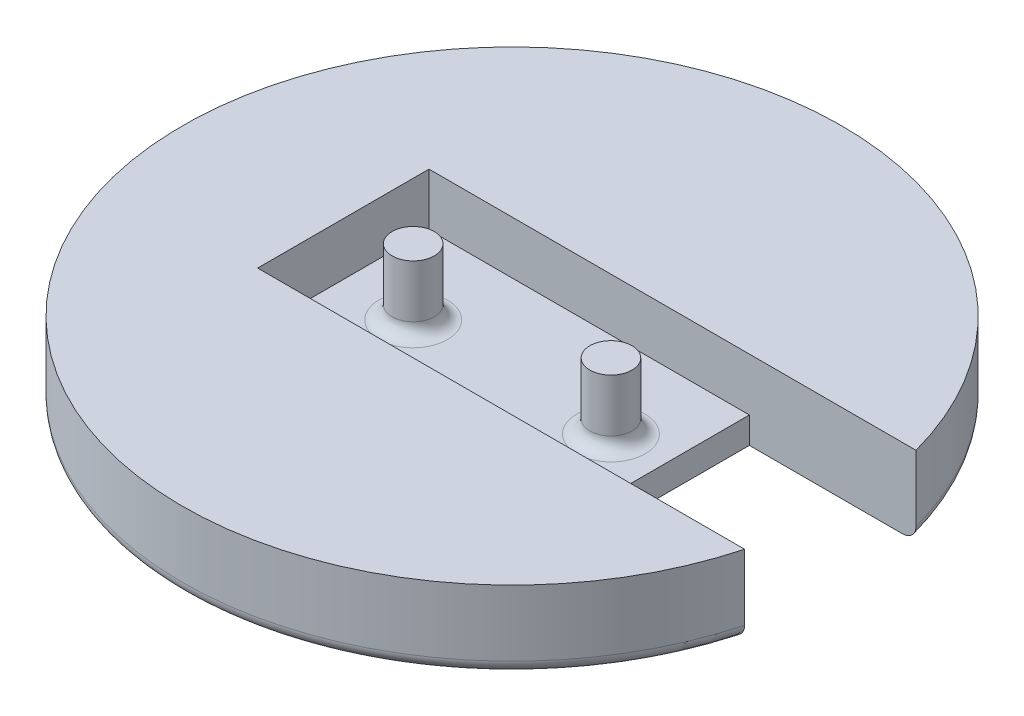
ISO-10303-21;
HEADER;
FILE_DESCRIPTION(('STEP AP214'),'2;1');
FILE_NAME('part.step','',(''),(''),'','','');
FILE_SCHEMA(('AUTOMOTIVE_DESIGN { 1 0 10303 214 1 1 1 1 }'));
ENDSEC;
DATA;
#1=APPLICATION_CONTEXT('core data for automotive mechanical design processes');
#2=APPLICATION_PROTOCOL_DEFINITION('international standard','automotive_design',2000,#1);
#3=PRODUCT_CONTEXT('',#1,'mechanical');
#4=PRODUCT('Part','Part','',(#3));
#5=PRODUCT_RELATED_PRODUCT_CATEGORY('part','',(#4));
#6=PRODUCT_DEFINITION_FORMATION('','',#4);
#7=PRODUCT_DEFINITION_CONTEXT('part definition',#1,'design');
#8=PRODUCT_DEFINITION('design','',#6,#7);
#9=PRODUCT_DEFINITION_SHAPE('','',#8);
#10=(LENGTH_UNIT() NAMED_UNIT(*) SI_UNIT(.MILLI.,.METRE.));
#11=(NAMED_UNIT(*) PLANE_ANGLE_UNIT() SI_UNIT($,.RADIAN.));
#12=(NAMED_UNIT(*) SI_UNIT($,.STERADIAN.) SOLID_ANGLE_UNIT());
#13=UNCERTAINTY_MEASURE_WITH_UNIT(LENGTH_MEASURE(1.E-05),#10,'distance_accuracy_value','');
#14=(GEOMETRIC_REPRESENTATION_CONTEXT(3) GLOBAL_UNCERTAINTY_ASSIGNED_CONTEXT((#13)) GLOBAL_UNIT_ASSIGNED_CONTEXT((#10,
#11,#12)) REPRESENTATION_CONTEXT('',''));
#15=CARTESIAN_POINT('',(0.,0.,0.));
#16=DIRECTION('',(0.,0.,1.));
#17=DIRECTION('',(1.,0.,0.));
#18=AXIS2_PLACEMENT_3D('',#15,#16,#17);
#19=CARTESIAN_POINT('',(0.,2.,0.));
#20=DIRECTION('',(0.,1.,0.));
#21=DIRECTION('',(0.,0.,1.));
#22=AXIS2_PLACEMENT_3D('',#19,#20,#21);
#23=PLANE('',#22);
#24=CARTESIAN_POINT('',(7.5,2.,0.));
#25=DIRECTION('',(0.,1.,0.));
#26=DIRECTION('',(0.,0.,1.));
#27=AXIS2_PLACEMENT_3D('',#24,#25,#26);
#28=CIRCLE('',#27,2.6);
#29=CARTESIAN_POINT('',(7.5,2.,2.6));
#30=VERTEX_POINT('',#29);
#31=EDGE_CURVE('E152',#30,#30,#28,.F.);
#32=ORIENTED_EDGE('',*,*,#31,.T.);
#33=EDGE_LOOP('',(#32));
#34=FACE_BOUND('',#33,.T.);
#35=CARTESIAN_POINT('',(-7.5,2.,0.));
#36=DIRECTION('',(0.,1.,0.));
#37=DIRECTION('',(0.,0.,1.));
#38=AXIS2_PLACEMENT_3D('',#35,#36,#37);
#39=CIRCLE('',#38,2.6);
#40=CARTESIAN_POINT('',(-7.5,2.,2.6));
#41=VERTEX_POINT('',#40);
#42=EDGE_CURVE('E149',#41,#41,#39,.F.);
#43=ORIENTED_EDGE('',*,*,#42,.T.);
#44=EDGE_LOOP('',(#43));
#45=FACE_BOUND('',#44,.T.);
#46=DIRECTION('',(0.,0.,1.));
#47=VECTOR('',#46,1.);
#48=CARTESIAN_POINT('',(11.5,2.,-6.5));
#49=LINE('',#48,#47);
#50=CARTESIAN_POINT('',(11.5,2.,-6.5));
#51=VERTEX_POINT('',#50);
#52=CARTESIAN_POINT('',(11.5,2.,6.5));
#53=VERTEX_POINT('',#52);
#54=EDGE_CURVE('E108',#51,#53,#49,.T.);
#55=ORIENTED_EDGE('',*,*,#54,.F.);
#56=DIRECTION('',(1.,0.,0.));
#57=VECTOR('',#56,1.);
#58=CARTESIAN_POINT('',(0.,2.,-6.5));
#59=LINE('',#58,#57);
#60=CARTESIAN_POINT('',(-12.8,2.,-6.5));
#61=VERTEX_POINT('',#60);
#62=EDGE_CURVE('E119',#61,#51,#59,.T.);
#63=ORIENTED_EDGE('',*,*,#62,.F.);
#64=DIRECTION('',(0.,0.,1.));
#65=VECTOR('',#64,1.);
#66=CARTESIAN_POINT('',(-12.8,2.,0.));
#67=LINE('',#66,#65);
#68=CARTESIAN_POINT('',(-12.8,2.,6.5));
#69=VERTEX_POINT('',#68);
#70=EDGE_CURVE('E129',#61,#69,#67,.T.);
#71=ORIENTED_EDGE('',*,*,#70,.T.);
#72=DIRECTION('',(1.,0.,0.));
#73=VECTOR('',#72,1.);
#74=CARTESIAN_POINT('',(0.,2.,6.5));
#75=LINE('',#74,#73);
#76=EDGE_CURVE('E122',#69,#53,#75,.T.);
#77=ORIENTED_EDGE('',*,*,#76,.T.);
#78=EDGE_LOOP('',(#55,#63,#71,#77));
#79=FACE_BOUND('',#78,.T.);
#80=ADVANCED_FACE('F41',(#34,#45,#79),#23,.T.);
#81=CARTESIAN_POINT('',(0.,2.,0.));
#82=DIRECTION('',(0.,-1.,0.));
#83=DIRECTION('',(0.,0.,-1.));
#84=AXIS2_PLACEMENT_3D('',#81,#82,#83);
#85=CYLINDRICAL_SURFACE('',#84,25.);
#86=DIRECTION('',(0.,-1.,0.));
#87=VECTOR('',#86,1.);
#88=CARTESIAN_POINT('',(24.1402154091466,6.,-6.5));
#89=LINE('',#88,#87);
#90=CARTESIAN_POINT('',(24.1402154091466,6.,-6.5));
#91=VERTEX_POINT('',#90);
#92=CARTESIAN_POINT('',(24.1402154091466,1.,-6.5));
#93=VERTEX_POINT('',#92);
#94=EDGE_CURVE('E142',#91,#93,#89,.T.);
#95=ORIENTED_EDGE('',*,*,#94,.T.);
#96=CARTESIAN_POINT('',(0.,1.,0.));
#97=DIRECTION('',(0.,1.,0.));
#98=DIRECTION('',(0.,0.,1.));
#99=AXIS2_PLACEMENT_3D('',#96,#97,#98);
#100=CIRCLE('',#99,25.);
#101=CARTESIAN_POINT('',(24.1402154091466,1.,6.5));
#102=VERTEX_POINT('',#101);
#103=EDGE_CURVE('E158',#93,#102,#100,.T.);
#104=ORIENTED_EDGE('',*,*,#103,.T.);
#105=DIRECTION('',(0.,-1.,0.));
#106=VECTOR('',#105,1.);
#107=CARTESIAN_POINT('',(24.1402154091466,6.,6.5));
#108=LINE('',#107,#106);
#109=CARTESIAN_POINT('',(24.1402154091466,6.,6.5));
#110=VERTEX_POINT('',#109);
#111=EDGE_CURVE('E139',#110,#102,#108,.T.);
#112=ORIENTED_EDGE('',*,*,#111,.F.);
#113=CARTESIAN_POINT('',(0.,6.,0.));
#114=DIRECTION('',(0.,1.,0.));
#115=DIRECTION('',(0.,0.,1.));
#116=AXIS2_PLACEMENT_3D('',#113,#114,#115);
#117=CIRCLE('',#116,25.);
#118=EDGE_CURVE('E226',#91,#110,#117,.T.);
#119=ORIENTED_EDGE('',*,*,#118,.F.);
#120=EDGE_LOOP('',(#95,#104,#112,#119));
#121=FACE_BOUND('',#120,.T.);
#122=ADVANCED_FACE('F182',(#121),#85,.T.);
#123=CARTESIAN_POINT('',(0.,0.,0.));
#124=DIRECTION('',(0.,1.,0.));
#125=DIRECTION('',(0.,0.,1.));
#126=AXIS2_PLACEMENT_3D('',#123,#124,#125);
#127=PLANE('',#126);
#128=DIRECTION('',(-1.,0.,0.));
#129=VECTOR('',#128,1.);
#130=CARTESIAN_POINT('',(11.5,0.,6.5));
#131=LINE('',#130,#129);
#132=CARTESIAN_POINT('',(23.1030301042958,0.,6.5));
#133=VERTEX_POINT('',#132);
#134=CARTESIAN_POINT('',(11.5,0.,6.5));
#135=VERTEX_POINT('',#134);
#136=EDGE_CURVE('E114',#133,#135,#131,.T.);
#137=ORIENTED_EDGE('',*,*,#136,.F.);
#138=CARTESIAN_POINT('',(0.,0.,0.));
#139=DIRECTION('',(0.,1.,0.));
#140=DIRECTION('',(0.,0.,1.));
#141=AXIS2_PLACEMENT_3D('',#138,#139,#140);
#142=CIRCLE('',#141,24.);
#143=CARTESIAN_POINT('',(23.1030301042958,0.,-6.5));
#144=VERTEX_POINT('',#143);
#145=EDGE_CURVE('E55',#133,#144,#142,.F.);
#146=ORIENTED_EDGE('',*,*,#145,.T.);
#147=DIRECTION('',(1.,0.,0.));
#148=VECTOR('',#147,1.);
#149=CARTESIAN_POINT('',(11.5,0.,-6.5));
#150=LINE('',#149,#148);
#151=CARTESIAN_POINT('',(11.5,0.,-6.5));
#152=VERTEX_POINT('',#151);
#153=EDGE_CURVE('E123',#152,#144,#150,.T.);
#154=ORIENTED_EDGE('',*,*,#153,.F.);
#155=DIRECTION('',(0.,0.,-1.));
#156=VECTOR('',#155,1.);
#157=CARTESIAN_POINT('',(11.5,0.,-6.5));
#158=LINE('',#157,#156);
#159=EDGE_CURVE('E111',#135,#152,#158,.T.);
#160=ORIENTED_EDGE('',*,*,#159,.F.);
#161=EDGE_LOOP('',(#137,#146,#154,#160));
#162=FACE_BOUND('',#161,.T.);
#163=ADVANCED_FACE('F178',(#162),#127,.F.);
#164=CARTESIAN_POINT('',(-12.8,6.,0.));
#165=DIRECTION('',(1.,0.,0.));
#166=DIRECTION('',(0.,0.,-1.));
#167=AXIS2_PLACEMENT_3D('',#164,#165,#166);
#168=PLANE('',#167);
#169=ORIENTED_EDGE('',*,*,#70,.F.);
#170=DIRECTION('',(0.,-1.,0.));
#171=VECTOR('',#170,1.);
#172=CARTESIAN_POINT('',(-12.8,6.,-6.5));
#173=LINE('',#172,#171);
#174=CARTESIAN_POINT('',(-12.8,6.,-6.5));
#175=VERTEX_POINT('',#174);
#176=EDGE_CURVE('E127',#175,#61,#173,.T.);
#177=ORIENTED_EDGE('',*,*,#176,.F.);
#178=DIRECTION('',(0.,0.,1.));
#179=VECTOR('',#178,1.);
#180=CARTESIAN_POINT('',(-12.8,6.,0.));
#181=LINE('',#180,#179);
#182=CARTESIAN_POINT('',(-12.8,6.,6.5));
#183=VERTEX_POINT('',#182);
#184=EDGE_CURVE('E131',#175,#183,#181,.T.);
#185=ORIENTED_EDGE('',*,*,#184,.T.);
#186=DIRECTION('',(0.,-1.,0.));
#187=VECTOR('',#186,1.);
#188=CARTESIAN_POINT('',(-12.8,6.,6.5));
#189=LINE('',#188,#187);
#190=EDGE_CURVE('E136',#183,#69,#189,.T.);
#191=ORIENTED_EDGE('',*,*,#190,.T.);
#192=EDGE_LOOP('',(#169,#177,#185,#191));
#193=FACE_BOUND('',#192,.T.);
#194=ADVANCED_FACE('F175',(#193),#168,.T.);
#195=CARTESIAN_POINT('',(0.,6.,-6.5));
#196=DIRECTION('',(0.,0.,-1.));
#197=DIRECTION('',(-1.,0.,0.));
#198=AXIS2_PLACEMENT_3D('',#195,#196,#197);
#199=PLANE('',#198);
#200=ORIENTED_EDGE('',*,*,#153,.T.);
#201=CARTESIAN_POINT('',(23.1030301042958,0.,-6.5));
#202=CARTESIAN_POINT('',(23.1630415020547,-4.07379461928211E-05,-6.5));
#203=CARTESIAN_POINT('',(23.2230543826841,0.00500385648985758,-6.5));
#204=CARTESIAN_POINT('',(23.3414319515449,0.0249995079032535,-6.5));
#205=CARTESIAN_POINT('',(23.3997959386903,0.0399547145540374,-6.5));
#206=CARTESIAN_POINT('',(23.5132240749441,0.0795253273005286,-6.5));
#207=CARTESIAN_POINT('',(23.5682851113786,0.104149685640048,-6.5));
#208=CARTESIAN_POINT('',(23.6733533652802,0.16246071700777,-6.5));
#209=CARTESIAN_POINT('',(23.7233632463739,0.196142579056975,-6.5));
#210=CARTESIAN_POINT('',(23.8158280924784,0.270975122606774,-6.5));
#211=CARTESIAN_POINT('',(23.858412152406,0.311966113934102,-6.5));
#212=CARTESIAN_POINT('',(23.935798240648,0.400760911553818,-6.5));
#213=CARTESIAN_POINT('',(23.9705994258328,0.448565455050072,-6.5));
#214=CARTESIAN_POINT('',(24.0301134062153,0.547811406869436,-6.5));
#215=CARTESIAN_POINT('',(24.0551367286314,0.599066905016923,-6.5));
#216=CARTESIAN_POINT('',(24.095891266569,0.705121150930986,-6.5));
#217=CARTESIAN_POINT('',(24.1116327864106,0.759915894258354,-6.5));
#218=CARTESIAN_POINT('',(24.1283635456409,0.845997783009671,-6.5));
#219=CARTESIAN_POINT('',(24.1328059369336,0.876651935967984,-6.5));
#220=CARTESIAN_POINT('',(24.138730442653,0.93819889948069,-6.5));
#221=CARTESIAN_POINT('',(24.1402169475169,0.969091287556799,-6.5));
#222=CARTESIAN_POINT('',(24.1402154091466,1.,-6.5));
#223=B_SPLINE_CURVE_WITH_KNOTS('',3,(#201,#202,#203,#204,#205,#206,#207,#208,#209,#210,#211,
#212,#213,#214,#215,#216,#217,#218,#219,#220,#221,#222),.UNSPECIFIED.,.F.,.F.,(4,2,2,2,2,2,2,2,
2,2,4),(0.,0.179827323787152,0.359729990705923,0.539799615851904,0.719773783585482,
0.89621304437835,1.07267140982926,1.24295223308869,1.4130436590981,1.50583996825724,
1.59849834194079),.UNSPECIFIED.);
#224=EDGE_CURVE('E11',#144,#93,#223,.T.);
#225=ORIENTED_EDGE('',*,*,#224,.T.);
#226=ORIENTED_EDGE('',*,*,#94,.F.);
#227=DIRECTION('',(1.,0.,0.));
#228=VECTOR('',#227,1.);
#229=CARTESIAN_POINT('',(0.,6.,-6.5));
#230=LINE('',#229,#228);
#231=EDGE_CURVE('E224',#175,#91,#230,.T.);
#232=ORIENTED_EDGE('',*,*,#231,.F.);
#233=ORIENTED_EDGE('',*,*,#176,.T.);
#234=ORIENTED_EDGE('',*,*,#62,.T.);
#235=DIRECTION('',(0.,1.,0.));
#236=VECTOR('',#235,1.);
#237=CARTESIAN_POINT('',(11.5,-0.00100000000000013,-6.5));
#238=LINE('',#237,#236);
#239=EDGE_CURVE('E104',#152,#51,#238,.T.);
#240=ORIENTED_EDGE('',*,*,#239,.F.);
#241=EDGE_LOOP('',(#200,#225,#226,#232,#233,#234,#240));
#242=FACE_BOUND('',#241,.T.);
#243=ADVANCED_FACE('F125',(#242),#199,.F.);
#244=CARTESIAN_POINT('',(0.,6.,6.5));
#245=DIRECTION('',(0.,0.,-1.));
#246=DIRECTION('',(-1.,0.,0.));
#247=AXIS2_PLACEMENT_3D('',#244,#245,#246);
#248=PLANE('',#247);
#249=ORIENTED_EDGE('',*,*,#111,.T.);
#250=CARTESIAN_POINT('',(24.1402154091466,1.,6.5));
#251=CARTESIAN_POINT('',(24.140215711531,0.972574378559675,6.5));
#252=CARTESIAN_POINT('',(24.1390462036471,0.945162140716668,6.5));
#253=CARTESIAN_POINT('',(24.1343838720928,0.890539107579561,6.5));
#254=CARTESIAN_POINT('',(24.1308913149175,0.863328289541028,6.5));
#255=CARTESIAN_POINT('',(24.1169770014243,0.782389398431225,6.5));
#256=CARTESIAN_POINT('',(24.1031184079865,0.729212150299668,6.5));
#257=CARTESIAN_POINT('',(24.0666957413309,0.625955034785746,6.5));
#258=CARTESIAN_POINT('',(24.0441303145989,0.575875650384598,6.5));
#259=CARTESIAN_POINT('',(23.9910268867018,0.480134523518647,6.5));
#260=CARTESIAN_POINT('',(23.9604881895474,0.434473167182023,6.5));
#261=CARTESIAN_POINT('',(23.8918959254077,0.348124440741823,6.5));
#262=CARTESIAN_POINT('',(23.8537407094715,0.307517943943999,6.5));
#263=CARTESIAN_POINT('',(23.7713427820477,0.233035342366017,6.5));
#264=CARTESIAN_POINT('',(23.7270986668402,0.199160793966627,6.5));
#265=CARTESIAN_POINT('',(23.6322447123132,0.137921388155156,6.5));
#266=CARTESIAN_POINT('',(23.5814736933651,0.110806450520316,6.5));
#267=CARTESIAN_POINT('',(23.4762057711506,0.0651735318225097,6.5));
#268=CARTESIAN_POINT('',(23.4217090938878,0.0466550298178436,6.5));
#269=CARTESIAN_POINT('',(23.3231169461925,0.0217776315225423,6.5));
#270=CARTESIAN_POINT('',(23.2794665813232,0.0136132632662862,6.5));
#271=CARTESIAN_POINT('',(23.1915575420011,0.00272432994374768,6.5));
#272=CARTESIAN_POINT('',(23.1472998572429,-8.22248499426573E-06,6.5));
#273=CARTESIAN_POINT('',(23.1030301042958,0.,6.5));
#274=B_SPLINE_CURVE_WITH_KNOTS('',3,(#250,#251,#252,#253,#254,#255,#256,#257,#258,#259,#260,
#261,#262,#263,#264,#265,#266,#267,#268,#269,#270,#271,#272,#273),.UNSPECIFIED.,.F.,.F.,(4,2,2,
2,2,2,2,2,2,2,2,4),(0.,0.0822254878023891,0.164441544505478,0.328450982718256,0.492485927172884,
0.656535195078799,0.822941020941132,0.989385274058812,1.16128810414714,1.3331805156096,
1.46607709299259,1.59877810397102),.UNSPECIFIED.);
#275=EDGE_CURVE('E69',#102,#133,#274,.T.);
#276=ORIENTED_EDGE('',*,*,#275,.T.);
#277=ORIENTED_EDGE('',*,*,#136,.T.);
#278=DIRECTION('',(0.,1.,0.));
#279=VECTOR('',#278,1.);
#280=CARTESIAN_POINT('',(11.5,-0.00100000000000013,6.5));
#281=LINE('',#280,#279);
#282=EDGE_CURVE('E115',#135,#53,#281,.T.);
#283=ORIENTED_EDGE('',*,*,#282,.T.);
#284=ORIENTED_EDGE('',*,*,#76,.F.);
#285=ORIENTED_EDGE('',*,*,#190,.F.);
#286=DIRECTION('',(1.,0.,0.));
#287=VECTOR('',#286,1.);
#288=CARTESIAN_POINT('',(0.,6.,6.5));
#289=LINE('',#288,#287);
#290=EDGE_CURVE('E140',#183,#110,#289,.T.);
#291=ORIENTED_EDGE('',*,*,#290,.T.);
#292=EDGE_LOOP('',(#249,#276,#277,#283,#284,#285,#291));
#293=FACE_BOUND('',#292,.T.);
#294=ADVANCED_FACE('F166',(#293),#248,.T.);
#295=CARTESIAN_POINT('',(0.,6.,0.));
#296=DIRECTION('',(0.,1.,0.));
#297=DIRECTION('',(0.,0.,1.));
#298=AXIS2_PLACEMENT_3D('',#295,#296,#297);
#299=PLANE('',#298);
#300=ORIENTED_EDGE('',*,*,#184,.F.);
#301=ORIENTED_EDGE('',*,*,#231,.T.);
#302=ORIENTED_EDGE('',*,*,#118,.T.);
#303=ORIENTED_EDGE('',*,*,#290,.F.);
#304=EDGE_LOOP('',(#300,#301,#302,#303));
#305=FACE_BOUND('',#304,.T.);
#306=ADVANCED_FACE('F170',(#305),#299,.T.);
#307=CARTESIAN_POINT('',(11.5,-0.00100000000000013,-6.5));
#308=DIRECTION('',(-1.,0.,0.));
#309=DIRECTION('',(0.,0.,1.));
#310=AXIS2_PLACEMENT_3D('',#307,#308,#309);
#311=PLANE('',#310);
#312=ORIENTED_EDGE('',*,*,#159,.T.);
#313=ORIENTED_EDGE('',*,*,#239,.T.);
#314=ORIENTED_EDGE('',*,*,#54,.T.);
#315=ORIENTED_EDGE('',*,*,#282,.F.);
#316=EDGE_LOOP('',(#312,#313,#314,#315));
#317=FACE_BOUND('',#316,.T.);
#318=ADVANCED_FACE('F106',(#317),#311,.F.);
#319=CARTESIAN_POINT('',(-7.5,7.,0.));
#320=DIRECTION('',(0.,-1.,0.));
#321=DIRECTION('',(0.,0.,-1.));
#322=AXIS2_PLACEMENT_3D('',#319,#320,#321);
#323=CYLINDRICAL_SURFACE('',#322,1.6);
#324=CARTESIAN_POINT('',(-7.5,3.,0.));
#325=DIRECTION('',(0.,1.,0.));
#326=DIRECTION('',(0.,0.,1.));
#327=AXIS2_PLACEMENT_3D('',#324,#325,#326);
#328=CIRCLE('',#327,1.6);
#329=CARTESIAN_POINT('',(-7.5,3.,1.6));
#330=VERTEX_POINT('',#329);
#331=EDGE_CURVE('E155',#330,#330,#328,.T.);
#332=ORIENTED_EDGE('',*,*,#331,.T.);
#333=EDGE_LOOP('',(#332));
#334=FACE_BOUND('',#333,.T.);
#335=CARTESIAN_POINT('',(-7.5,7.,0.));
#336=DIRECTION('',(0.,1.,0.));
#337=DIRECTION('',(0.,0.,1.));
#338=AXIS2_PLACEMENT_3D('',#335,#336,#337);
#339=CIRCLE('',#338,1.6);
#340=CARTESIAN_POINT('',(-7.5,7.,1.6));
#341=VERTEX_POINT('',#340);
#342=EDGE_CURVE('E211',#341,#341,#339,.T.);
#343=ORIENTED_EDGE('',*,*,#342,.F.);
#344=EDGE_LOOP('',(#343));
#345=FACE_BOUND('',#344,.T.);
#346=ADVANCED_FACE('F204',(#334,#345),#323,.T.);
#347=CARTESIAN_POINT('',(-7.5,7.,0.));
#348=DIRECTION('',(0.,1.,0.));
#349=DIRECTION('',(0.,0.,1.));
#350=AXIS2_PLACEMENT_3D('',#347,#348,#349);
#351=PLANE('',#350);
#352=ORIENTED_EDGE('',*,*,#342,.T.);
#353=EDGE_LOOP('',(#352));
#354=FACE_BOUND('',#353,.T.);
#355=ADVANCED_FACE('F207',(#354),#351,.T.);
#356=CARTESIAN_POINT('',(7.5,7.,0.));
#357=DIRECTION('',(0.,-1.,0.));
#358=DIRECTION('',(0.,0.,-1.));
#359=AXIS2_PLACEMENT_3D('',#356,#357,#358);
#360=CYLINDRICAL_SURFACE('',#359,1.6);
#361=CARTESIAN_POINT('',(7.5,3.,0.));
#362=DIRECTION('',(0.,1.,0.));
#363=DIRECTION('',(0.,0.,1.));
#364=AXIS2_PLACEMENT_3D('',#361,#362,#363);
#365=CIRCLE('',#364,1.6);
#366=CARTESIAN_POINT('',(7.5,3.,1.6));
#367=VERTEX_POINT('',#366);
#368=EDGE_CURVE('E146',#367,#367,#365,.T.);
#369=ORIENTED_EDGE('',*,*,#368,.T.);
#370=EDGE_LOOP('',(#369));
#371=FACE_BOUND('',#370,.T.);
#372=CARTESIAN_POINT('',(7.5,7.,0.));
#373=DIRECTION('',(0.,1.,0.));
#374=DIRECTION('',(0.,0.,1.));
#375=AXIS2_PLACEMENT_3D('',#372,#373,#374);
#376=CIRCLE('',#375,1.6);
#377=CARTESIAN_POINT('',(7.5,7.,1.6));
#378=VERTEX_POINT('',#377);
#379=EDGE_CURVE('E213',#378,#378,#376,.T.);
#380=ORIENTED_EDGE('',*,*,#379,.F.);
#381=EDGE_LOOP('',(#380));
#382=FACE_BOUND('',#381,.T.);
#383=ADVANCED_FACE('F244',(#371,#382),#360,.T.);
#384=CARTESIAN_POINT('',(7.5,7.,0.));
#385=DIRECTION('',(0.,1.,0.));
#386=DIRECTION('',(0.,0.,1.));
#387=AXIS2_PLACEMENT_3D('',#384,#385,#386);
#388=PLANE('',#387);
#389=ORIENTED_EDGE('',*,*,#379,.T.);
#390=EDGE_LOOP('',(#389));
#391=FACE_BOUND('',#390,.T.);
#392=ADVANCED_FACE('F192',(#391),#388,.T.);
#393=CARTESIAN_POINT('',(7.5,3.,0.));
#394=DIRECTION('',(0.,1.,0.));
#395=DIRECTION('',(0.,0.,1.));
#396=AXIS2_PLACEMENT_3D('',#393,#394,#395);
#397=TOROIDAL_SURFACE('',#396,2.6,1.);
#398=ORIENTED_EDGE('',*,*,#31,.F.);
#399=EDGE_LOOP('',(#398));
#400=FACE_BOUND('',#399,.T.);
#401=ORIENTED_EDGE('',*,*,#368,.F.);
#402=EDGE_LOOP('',(#401));
#403=FACE_BOUND('',#402,.T.);
#404=ADVANCED_FACE('F189',(#400,#403),#397,.F.);
#405=CARTESIAN_POINT('',(-7.5,3.,0.));
#406=DIRECTION('',(0.,1.,0.));
#407=DIRECTION('',(0.,0.,1.));
#408=AXIS2_PLACEMENT_3D('',#405,#406,#407);
#409=TOROIDAL_SURFACE('',#408,2.6,1.);
#410=ORIENTED_EDGE('',*,*,#42,.F.);
#411=EDGE_LOOP('',(#410));
#412=FACE_BOUND('',#411,.T.);
#413=ORIENTED_EDGE('',*,*,#331,.F.);
#414=EDGE_LOOP('',(#413));
#415=FACE_BOUND('',#414,.T.);
#416=ADVANCED_FACE('F191',(#412,#415),#409,.F.);
#417=CARTESIAN_POINT('',(0.,1.,0.));
#418=DIRECTION('',(0.,1.,0.));
#419=DIRECTION('',(0.,0.,1.));
#420=AXIS2_PLACEMENT_3D('',#417,#418,#419);
#421=TOROIDAL_SURFACE('',#420,24.,1.);
#422=ORIENTED_EDGE('',*,*,#224,.F.);
#423=ORIENTED_EDGE('',*,*,#145,.F.);
#424=ORIENTED_EDGE('',*,*,#275,.F.);
#425=ORIENTED_EDGE('',*,*,#103,.F.);
#426=EDGE_LOOP('',(#422,#423,#424,#425));
#427=FACE_BOUND('',#426,.T.);
#428=ADVANCED_FACE('F43',(#427),#421,.T.);
#429=CLOSED_SHELL('',(#80,#122,#163,#194,#243,#294,#306,#318,#346,#355,#383,#392,#404,#416,#428));
#430=MANIFOLD_SOLID_BREP('B2',#429);
#431=ADVANCED_BREP_SHAPE_REPRESENTATION('',(#18,#430),#14);
#432=SHAPE_DEFINITION_REPRESENTATION(#9,#431);
ENDSEC;
END-ISO-10303-21;
